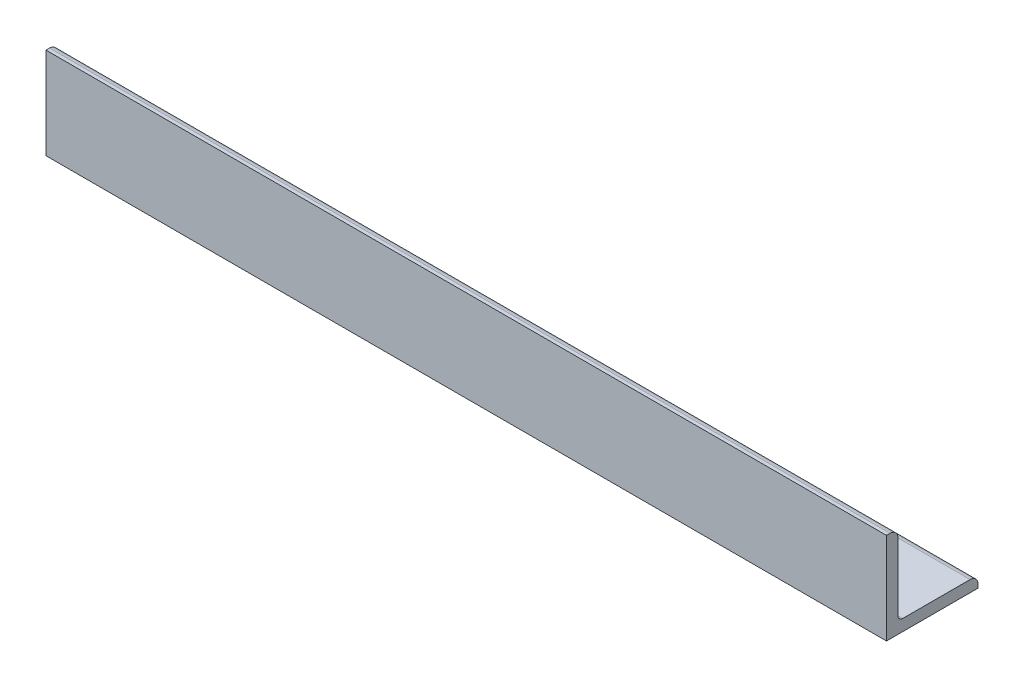
ISO-10303-21;
HEADER;
FILE_DESCRIPTION(('STEP AP214'),'2;1');
FILE_NAME('part.step','',(''),(''),'','','');
FILE_SCHEMA(('AUTOMOTIVE_DESIGN { 1 0 10303 214 1 1 1 1 }'));
ENDSEC;
DATA;
#1=APPLICATION_CONTEXT('core data for automotive mechanical design processes');
#2=APPLICATION_PROTOCOL_DEFINITION('international standard','automotive_design',2000,#1);
#3=PRODUCT_CONTEXT('',#1,'mechanical');
#4=PRODUCT('Part','Part','',(#3));
#5=PRODUCT_RELATED_PRODUCT_CATEGORY('part','',(#4));
#6=PRODUCT_DEFINITION_FORMATION('','',#4);
#7=PRODUCT_DEFINITION_CONTEXT('part definition',#1,'design');
#8=PRODUCT_DEFINITION('design','',#6,#7);
#9=PRODUCT_DEFINITION_SHAPE('','',#8);
#10=(LENGTH_UNIT() NAMED_UNIT(*) SI_UNIT(.MILLI.,.METRE.));
#11=(NAMED_UNIT(*) PLANE_ANGLE_UNIT() SI_UNIT($,.RADIAN.));
#12=(NAMED_UNIT(*) SI_UNIT($,.STERADIAN.) SOLID_ANGLE_UNIT());
#13=UNCERTAINTY_MEASURE_WITH_UNIT(LENGTH_MEASURE(1.E-05),#10,'distance_accuracy_value','');
#14=(GEOMETRIC_REPRESENTATION_CONTEXT(3) GLOBAL_UNCERTAINTY_ASSIGNED_CONTEXT((#13)) GLOBAL_UNIT_ASSIGNED_CONTEXT((#10,
#11,#12)) REPRESENTATION_CONTEXT('',''));
#15=CARTESIAN_POINT('',(0.,0.,0.));
#16=DIRECTION('',(0.,0.,1.));
#17=DIRECTION('',(1.,0.,0.));
#18=AXIS2_PLACEMENT_3D('',#15,#16,#17);
#19=CARTESIAN_POINT('',(175.,0.,-38.1000000000001));
#20=DIRECTION('',(0.,1.,0.));
#21=DIRECTION('',(0.,0.,1.));
#22=AXIS2_PLACEMENT_3D('',#19,#20,#21);
#23=PLANE('',#22);
#24=DIRECTION('',(0.,0.,-1.));
#25=VECTOR('',#24,1.);
#26=CARTESIAN_POINT('',(-175.,0.,-38.1));
#27=LINE('',#26,#25);
#28=CARTESIAN_POINT('',(-175.,0.,0.));
#29=VERTEX_POINT('',#28);
#30=CARTESIAN_POINT('',(-175.,0.,-38.1));
#31=VERTEX_POINT('',#30);
#32=EDGE_CURVE('E215',#29,#31,#27,.T.);
#33=ORIENTED_EDGE('',*,*,#32,.T.);
#34=DIRECTION('',(-1.,0.,0.));
#35=VECTOR('',#34,1.);
#36=CARTESIAN_POINT('',(175.,0.,-38.1000000000001));
#37=LINE('',#36,#35);
#38=CARTESIAN_POINT('',(175.,0.,-38.1000000000001));
#39=VERTEX_POINT('',#38);
#40=EDGE_CURVE('E256',#39,#31,#37,.T.);
#41=ORIENTED_EDGE('',*,*,#40,.F.);
#42=DIRECTION('',(0.,0.,-1.));
#43=VECTOR('',#42,1.);
#44=CARTESIAN_POINT('',(175.,0.,-38.1000000000001));
#45=LINE('',#44,#43);
#46=CARTESIAN_POINT('',(175.,0.,0.));
#47=VERTEX_POINT('',#46);
#48=EDGE_CURVE('E194',#47,#39,#45,.T.);
#49=ORIENTED_EDGE('',*,*,#48,.F.);
#50=DIRECTION('',(-1.,0.,0.));
#51=VECTOR('',#50,1.);
#52=CARTESIAN_POINT('',(175.,0.,0.));
#53=LINE('',#52,#51);
#54=EDGE_CURVE('E214',#47,#29,#53,.T.);
#55=ORIENTED_EDGE('',*,*,#54,.T.);
#56=EDGE_LOOP('',(#33,#41,#49,#55));
#57=FACE_BOUND('',#56,.T.);
#58=CARTESIAN_POINT('',(-87.5,0.,-19.76));
#59=DIRECTION('',(0.,1.,0.));
#60=DIRECTION('',(0.,0.,1.));
#61=AXIS2_PLACEMENT_3D('',#58,#59,#60);
#62=CIRCLE('',#61,4.00000000000001);
#63=CARTESIAN_POINT('',(-87.5,0.,-23.76));
#64=VERTEX_POINT('',#63);
#65=EDGE_CURVE('E190',#64,#64,#62,.T.);
#66=ORIENTED_EDGE('',*,*,#65,.T.);
#67=EDGE_LOOP('',(#66));
#68=FACE_BOUND('',#67,.T.);
#69=CARTESIAN_POINT('',(0.,0.,-12.));
#70=DIRECTION('',(0.,1.,0.));
#71=DIRECTION('',(0.,0.,1.));
#72=AXIS2_PLACEMENT_3D('',#69,#70,#71);
#73=CIRCLE('',#72,5.);
#74=CARTESIAN_POINT('',(-5.,0.,-12.));
#75=VERTEX_POINT('',#74);
#76=CARTESIAN_POINT('',(5.,0.,-12.));
#77=VERTEX_POINT('',#76);
#78=EDGE_CURVE('E82',#75,#77,#73,.T.);
#79=ORIENTED_EDGE('',*,*,#78,.T.);
#80=DIRECTION('',(0.,0.,-1.));
#81=VECTOR('',#80,1.);
#82=CARTESIAN_POINT('',(5.,0.,-12.));
#83=LINE('',#82,#81);
#84=CARTESIAN_POINT('',(5.,0.,-26.1000000000001));
#85=VERTEX_POINT('',#84);
#86=EDGE_CURVE('E170',#77,#85,#83,.T.);
#87=ORIENTED_EDGE('',*,*,#86,.T.);
#88=CARTESIAN_POINT('',(0.,0.,-26.1000000000001));
#89=DIRECTION('',(0.,1.,0.));
#90=DIRECTION('',(0.,0.,1.));
#91=AXIS2_PLACEMENT_3D('',#88,#89,#90);
#92=CIRCLE('',#91,5.);
#93=CARTESIAN_POINT('',(-5.,0.,-26.1000000000001));
#94=VERTEX_POINT('',#93);
#95=EDGE_CURVE('E176',#85,#94,#92,.T.);
#96=ORIENTED_EDGE('',*,*,#95,.T.);
#97=DIRECTION('',(0.,0.,1.));
#98=VECTOR('',#97,1.);
#99=CARTESIAN_POINT('',(-5.,0.,-12.));
#100=LINE('',#99,#98);
#101=EDGE_CURVE('E180',#94,#75,#100,.T.);
#102=ORIENTED_EDGE('',*,*,#101,.T.);
#103=EDGE_LOOP('',(#79,#87,#96,#102));
#104=FACE_BOUND('',#103,.T.);
#105=CARTESIAN_POINT('',(87.5,0.,-19.76));
#106=DIRECTION('',(0.,1.,0.));
#107=DIRECTION('',(0.,0.,-1.));
#108=AXIS2_PLACEMENT_3D('',#105,#106,#107);
#109=CIRCLE('',#108,4.00000000000001);
#110=CARTESIAN_POINT('',(87.5,0.,-23.76));
#111=VERTEX_POINT('',#110);
#112=EDGE_CURVE('E166',#111,#111,#109,.T.);
#113=ORIENTED_EDGE('',*,*,#112,.T.);
#114=EDGE_LOOP('',(#113));
#115=FACE_BOUND('',#114,.T.);
#116=ADVANCED_FACE('F67',(#57,#68,#104,#115),#23,.F.);
#117=CARTESIAN_POINT('',(175.,4.76249999999999,-6.76250000000006));
#118=DIRECTION('',(0.,-1.,0.));
#119=DIRECTION('',(0.,0.,-1.));
#120=AXIS2_PLACEMENT_3D('',#117,#118,#119);
#121=PLANE('',#120);
#122=DIRECTION('',(0.,0.,1.));
#123=VECTOR('',#122,1.);
#124=CARTESIAN_POINT('',(-175.,4.76249999999999,-6.7625));
#125=LINE('',#124,#123);
#126=CARTESIAN_POINT('',(-175.,4.7625,-34.8375));
#127=VERTEX_POINT('',#126);
#128=CARTESIAN_POINT('',(-175.,4.76249999999999,-6.7625));
#129=VERTEX_POINT('',#128);
#130=EDGE_CURVE('E222',#127,#129,#125,.T.);
#131=ORIENTED_EDGE('',*,*,#130,.T.);
#132=DIRECTION('',(-1.,0.,0.));
#133=VECTOR('',#132,1.);
#134=CARTESIAN_POINT('',(175.,4.76249999999999,-6.76250000000006));
#135=LINE('',#134,#133);
#136=CARTESIAN_POINT('',(175.,4.76249999999999,-6.76250000000006));
#137=VERTEX_POINT('',#136);
#138=EDGE_CURVE('E247',#137,#129,#135,.T.);
#139=ORIENTED_EDGE('',*,*,#138,.F.);
#140=DIRECTION('',(0.,0.,1.));
#141=VECTOR('',#140,1.);
#142=CARTESIAN_POINT('',(175.,4.76249999999999,-6.76250000000006));
#143=LINE('',#142,#141);
#144=CARTESIAN_POINT('',(175.,4.7625,-34.8375000000001));
#145=VERTEX_POINT('',#144);
#146=EDGE_CURVE('E202',#145,#137,#143,.T.);
#147=ORIENTED_EDGE('',*,*,#146,.F.);
#148=DIRECTION('',(-1.,0.,0.));
#149=VECTOR('',#148,1.);
#150=CARTESIAN_POINT('',(175.,4.7625,-34.8375000000001));
#151=LINE('',#150,#149);
#152=EDGE_CURVE('E250',#145,#127,#151,.T.);
#153=ORIENTED_EDGE('',*,*,#152,.T.);
#154=EDGE_LOOP('',(#131,#139,#147,#153));
#155=FACE_BOUND('',#154,.T.);
#156=CARTESIAN_POINT('',(-87.5,4.7625,-19.76));
#157=DIRECTION('',(0.,-1.,0.));
#158=DIRECTION('',(0.,0.,-1.));
#159=AXIS2_PLACEMENT_3D('',#156,#157,#158);
#160=CIRCLE('',#159,4.00000000000001);
#161=CARTESIAN_POINT('',(-87.5,4.7625,-23.76));
#162=VERTEX_POINT('',#161);
#163=EDGE_CURVE('E193',#162,#162,#160,.F.);
#164=ORIENTED_EDGE('',*,*,#163,.F.);
#165=EDGE_LOOP('',(#164));
#166=FACE_BOUND('',#165,.T.);
#167=CARTESIAN_POINT('',(0.,4.7625,-12.));
#168=DIRECTION('',(0.,-1.,0.));
#169=DIRECTION('',(0.,0.,-1.));
#170=AXIS2_PLACEMENT_3D('',#167,#168,#169);
#171=CIRCLE('',#170,5.);
#172=CARTESIAN_POINT('',(-5.,4.76250000000001,-12.));
#173=VERTEX_POINT('',#172);
#174=CARTESIAN_POINT('',(5.,4.76250000000001,-12.));
#175=VERTEX_POINT('',#174);
#176=EDGE_CURVE('E13',#173,#175,#171,.F.);
#177=ORIENTED_EDGE('',*,*,#176,.F.);
#178=DIRECTION('',(0.,0.,1.));
#179=VECTOR('',#178,1.);
#180=CARTESIAN_POINT('',(-5.,4.76249999999999,-6.76250000000006));
#181=LINE('',#180,#179);
#182=CARTESIAN_POINT('',(-5.,4.7625,-26.1000000000001));
#183=VERTEX_POINT('',#182);
#184=EDGE_CURVE('E259',#183,#173,#181,.T.);
#185=ORIENTED_EDGE('',*,*,#184,.F.);
#186=CARTESIAN_POINT('',(0.,4.7625,-26.1000000000001));
#187=DIRECTION('',(0.,-1.,0.));
#188=DIRECTION('',(0.,0.,-1.));
#189=AXIS2_PLACEMENT_3D('',#186,#187,#188);
#190=CIRCLE('',#189,5.);
#191=CARTESIAN_POINT('',(5.,4.76250000000001,-26.1000000000001));
#192=VERTEX_POINT('',#191);
#193=EDGE_CURVE('E263',#192,#183,#190,.F.);
#194=ORIENTED_EDGE('',*,*,#193,.F.);
#195=DIRECTION('',(0.,0.,-1.));
#196=VECTOR('',#195,1.);
#197=CARTESIAN_POINT('',(5.,4.76249999999999,-6.76250000000006));
#198=LINE('',#197,#196);
#199=EDGE_CURVE('E75',#175,#192,#198,.T.);
#200=ORIENTED_EDGE('',*,*,#199,.F.);
#201=EDGE_LOOP('',(#177,#185,#194,#200));
#202=FACE_BOUND('',#201,.T.);
#203=CARTESIAN_POINT('',(87.5,4.7625,-19.76));
#204=DIRECTION('',(0.,-1.,0.));
#205=DIRECTION('',(0.,0.,-1.));
#206=AXIS2_PLACEMENT_3D('',#203,#204,#205);
#207=CIRCLE('',#206,4.00000000000001);
#208=CARTESIAN_POINT('',(87.5,4.7625,-23.76));
#209=VERTEX_POINT('',#208);
#210=EDGE_CURVE('E70',#209,#209,#207,.F.);
#211=ORIENTED_EDGE('',*,*,#210,.F.);
#212=EDGE_LOOP('',(#211));
#213=FACE_BOUND('',#212,.T.);
#214=ADVANCED_FACE('F270',(#155,#166,#202,#213),#121,.F.);
#215=CARTESIAN_POINT('',(175.,1.5,-38.1000000000001));
#216=DIRECTION('',(0.,0.,1.));
#217=DIRECTION('',(1.,0.,0.));
#218=AXIS2_PLACEMENT_3D('',#215,#216,#217);
#219=PLANE('',#218);
#220=DIRECTION('',(0.,1.,0.));
#221=VECTOR('',#220,1.);
#222=CARTESIAN_POINT('',(-175.,1.5,-38.1));
#223=LINE('',#222,#221);
#224=CARTESIAN_POINT('',(-175.,1.5,-38.1));
#225=VERTEX_POINT('',#224);
#226=EDGE_CURVE('E218',#31,#225,#223,.T.);
#227=ORIENTED_EDGE('',*,*,#226,.T.);
#228=DIRECTION('',(-1.,0.,0.));
#229=VECTOR('',#228,1.);
#230=CARTESIAN_POINT('',(175.,1.5,-38.1000000000001));
#231=LINE('',#230,#229);
#232=CARTESIAN_POINT('',(175.,1.5,-38.1000000000001));
#233=VERTEX_POINT('',#232);
#234=EDGE_CURVE('E253',#233,#225,#231,.T.);
#235=ORIENTED_EDGE('',*,*,#234,.F.);
#236=DIRECTION('',(0.,1.,0.));
#237=VECTOR('',#236,1.);
#238=CARTESIAN_POINT('',(175.,1.5,-38.1000000000001));
#239=LINE('',#238,#237);
#240=EDGE_CURVE('E197',#39,#233,#239,.T.);
#241=ORIENTED_EDGE('',*,*,#240,.F.);
#242=ORIENTED_EDGE('',*,*,#40,.T.);
#243=EDGE_LOOP('',(#227,#235,#241,#242));
#244=FACE_BOUND('',#243,.T.);
#245=ADVANCED_FACE('F288',(#244),#219,.F.);
#246=CARTESIAN_POINT('',(175.,1.5,-34.8375000000001));
#247=DIRECTION('',(-1.,0.,0.));
#248=DIRECTION('',(0.,0.,1.));
#249=AXIS2_PLACEMENT_3D('',#246,#247,#248);
#250=CYLINDRICAL_SURFACE('',#249,3.2625);
#251=CARTESIAN_POINT('',(-175.,1.5,-34.8375));
#252=DIRECTION('',(1.,0.,0.));
#253=DIRECTION('',(0.,0.,-1.));
#254=AXIS2_PLACEMENT_3D('',#251,#252,#253);
#255=CIRCLE('',#254,3.2625);
#256=EDGE_CURVE('E220',#225,#127,#255,.T.);
#257=ORIENTED_EDGE('',*,*,#256,.T.);
#258=ORIENTED_EDGE('',*,*,#152,.F.);
#259=CARTESIAN_POINT('',(175.,1.5,-34.8375000000001));
#260=DIRECTION('',(1.,0.,0.));
#261=DIRECTION('',(0.,0.,-1.));
#262=AXIS2_PLACEMENT_3D('',#259,#260,#261);
#263=CIRCLE('',#262,3.2625);
#264=EDGE_CURVE('E200',#233,#145,#263,.T.);
#265=ORIENTED_EDGE('',*,*,#264,.F.);
#266=ORIENTED_EDGE('',*,*,#234,.T.);
#267=EDGE_LOOP('',(#257,#258,#265,#266));
#268=FACE_BOUND('',#267,.T.);
#269=ADVANCED_FACE('F334',(#268),#250,.T.);
#270=CARTESIAN_POINT('',(175.,6.76249999999999,-6.76250000000006));
#271=DIRECTION('',(-1.,0.,0.));
#272=DIRECTION('',(0.,0.,1.));
#273=AXIS2_PLACEMENT_3D('',#270,#271,#272);
#274=CYLINDRICAL_SURFACE('',#273,2.);
#275=CARTESIAN_POINT('',(-175.,6.76249999999999,-6.7625));
#276=DIRECTION('',(-1.,0.,0.));
#277=DIRECTION('',(0.,0.,1.));
#278=AXIS2_PLACEMENT_3D('',#275,#276,#277);
#279=CIRCLE('',#278,2.);
#280=CARTESIAN_POINT('',(-175.,6.76249999999999,-4.7625));
#281=VERTEX_POINT('',#280);
#282=EDGE_CURVE('E224',#129,#281,#279,.T.);
#283=ORIENTED_EDGE('',*,*,#282,.T.);
#284=DIRECTION('',(-1.,0.,0.));
#285=VECTOR('',#284,1.);
#286=CARTESIAN_POINT('',(175.,6.76249999999999,-4.76250000000006));
#287=LINE('',#286,#285);
#288=CARTESIAN_POINT('',(175.,6.76249999999999,-4.76250000000006));
#289=VERTEX_POINT('',#288);
#290=EDGE_CURVE('E244',#289,#281,#287,.T.);
#291=ORIENTED_EDGE('',*,*,#290,.F.);
#292=CARTESIAN_POINT('',(175.,6.76249999999999,-6.76250000000006));
#293=DIRECTION('',(-1.,0.,0.));
#294=DIRECTION('',(0.,0.,1.));
#295=AXIS2_PLACEMENT_3D('',#292,#293,#294);
#296=CIRCLE('',#295,2.);
#297=EDGE_CURVE('E204',#137,#289,#296,.T.);
#298=ORIENTED_EDGE('',*,*,#297,.F.);
#299=ORIENTED_EDGE('',*,*,#138,.T.);
#300=EDGE_LOOP('',(#283,#291,#298,#299));
#301=FACE_BOUND('',#300,.T.);
#302=ADVANCED_FACE('F331',(#301),#274,.F.);
#303=CARTESIAN_POINT('',(175.,34.8375,-4.76250000000006));
#304=DIRECTION('',(0.,0.,1.));
#305=DIRECTION('',(1.,0.,0.));
#306=AXIS2_PLACEMENT_3D('',#303,#304,#305);
#307=PLANE('',#306);
#308=DIRECTION('',(0.,1.,0.));
#309=VECTOR('',#308,1.);
#310=CARTESIAN_POINT('',(-175.,34.8375,-4.7625));
#311=LINE('',#310,#309);
#312=CARTESIAN_POINT('',(-175.,34.8375,-4.7625));
#313=VERTEX_POINT('',#312);
#314=EDGE_CURVE('E226',#281,#313,#311,.T.);
#315=ORIENTED_EDGE('',*,*,#314,.T.);
#316=DIRECTION('',(-1.,0.,0.));
#317=VECTOR('',#316,1.);
#318=CARTESIAN_POINT('',(175.,34.8375,-4.76250000000006));
#319=LINE('',#318,#317);
#320=CARTESIAN_POINT('',(175.,34.8375,-4.76250000000006));
#321=VERTEX_POINT('',#320);
#322=EDGE_CURVE('E241',#321,#313,#319,.T.);
#323=ORIENTED_EDGE('',*,*,#322,.F.);
#324=DIRECTION('',(0.,1.,0.));
#325=VECTOR('',#324,1.);
#326=CARTESIAN_POINT('',(175.,34.8375,-4.76250000000006));
#327=LINE('',#326,#325);
#328=EDGE_CURVE('E206',#289,#321,#327,.T.);
#329=ORIENTED_EDGE('',*,*,#328,.F.);
#330=ORIENTED_EDGE('',*,*,#290,.T.);
#331=EDGE_LOOP('',(#315,#323,#329,#330));
#332=FACE_BOUND('',#331,.T.);
#333=ADVANCED_FACE('F327',(#332),#307,.F.);
#334=CARTESIAN_POINT('',(175.,34.8375,-1.50000000000006));
#335=DIRECTION('',(-1.,0.,0.));
#336=DIRECTION('',(0.,0.,1.));
#337=AXIS2_PLACEMENT_3D('',#334,#335,#336);
#338=CYLINDRICAL_SURFACE('',#337,3.2625);
#339=CARTESIAN_POINT('',(-175.,34.8375,-1.5));
#340=DIRECTION('',(1.,0.,0.));
#341=DIRECTION('',(0.,0.,1.));
#342=AXIS2_PLACEMENT_3D('',#339,#340,#341);
#343=CIRCLE('',#342,3.2625);
#344=CARTESIAN_POINT('',(-175.,38.1,-1.5));
#345=VERTEX_POINT('',#344);
#346=EDGE_CURVE('E228',#313,#345,#343,.T.);
#347=ORIENTED_EDGE('',*,*,#346,.T.);
#348=DIRECTION('',(-1.,0.,0.));
#349=VECTOR('',#348,1.);
#350=CARTESIAN_POINT('',(175.,38.1,-1.50000000000006));
#351=LINE('',#350,#349);
#352=CARTESIAN_POINT('',(175.,38.1,-1.50000000000006));
#353=VERTEX_POINT('',#352);
#354=EDGE_CURVE('E238',#353,#345,#351,.T.);
#355=ORIENTED_EDGE('',*,*,#354,.F.);
#356=CARTESIAN_POINT('',(175.,34.8375,-1.50000000000006));
#357=DIRECTION('',(1.,0.,0.));
#358=DIRECTION('',(0.,0.,1.));
#359=AXIS2_PLACEMENT_3D('',#356,#357,#358);
#360=CIRCLE('',#359,3.2625);
#361=EDGE_CURVE('E208',#321,#353,#360,.T.);
#362=ORIENTED_EDGE('',*,*,#361,.F.);
#363=ORIENTED_EDGE('',*,*,#322,.T.);
#364=EDGE_LOOP('',(#347,#355,#362,#363));
#365=FACE_BOUND('',#364,.T.);
#366=ADVANCED_FACE('F323',(#365),#338,.T.);
#367=CARTESIAN_POINT('',(175.,38.1,0.));
#368=DIRECTION('',(0.,-1.,0.));
#369=DIRECTION('',(0.,0.,-1.));
#370=AXIS2_PLACEMENT_3D('',#367,#368,#369);
#371=PLANE('',#370);
#372=DIRECTION('',(0.,0.,1.));
#373=VECTOR('',#372,1.);
#374=CARTESIAN_POINT('',(-175.,38.1,0.));
#375=LINE('',#374,#373);
#376=CARTESIAN_POINT('',(-175.,38.1,0.));
#377=VERTEX_POINT('',#376);
#378=EDGE_CURVE('E230',#345,#377,#375,.T.);
#379=ORIENTED_EDGE('',*,*,#378,.T.);
#380=DIRECTION('',(-1.,0.,0.));
#381=VECTOR('',#380,1.);
#382=CARTESIAN_POINT('',(175.,38.1,0.));
#383=LINE('',#382,#381);
#384=CARTESIAN_POINT('',(175.,38.1,0.));
#385=VERTEX_POINT('',#384);
#386=EDGE_CURVE('E235',#385,#377,#383,.T.);
#387=ORIENTED_EDGE('',*,*,#386,.F.);
#388=DIRECTION('',(0.,0.,1.));
#389=VECTOR('',#388,1.);
#390=CARTESIAN_POINT('',(175.,38.1,0.));
#391=LINE('',#390,#389);
#392=EDGE_CURVE('E210',#353,#385,#391,.T.);
#393=ORIENTED_EDGE('',*,*,#392,.F.);
#394=ORIENTED_EDGE('',*,*,#354,.T.);
#395=EDGE_LOOP('',(#379,#387,#393,#394));
#396=FACE_BOUND('',#395,.T.);
#397=ADVANCED_FACE('F319',(#396),#371,.F.);
#398=CARTESIAN_POINT('',(175.,0.,0.));
#399=DIRECTION('',(0.,0.,-1.));
#400=DIRECTION('',(-1.,0.,0.));
#401=AXIS2_PLACEMENT_3D('',#398,#399,#400);
#402=PLANE('',#401);
#403=DIRECTION('',(0.,-1.,0.));
#404=VECTOR('',#403,1.);
#405=CARTESIAN_POINT('',(-175.,0.,0.));
#406=LINE('',#405,#404);
#407=EDGE_CURVE('E198',#377,#29,#406,.T.);
#408=ORIENTED_EDGE('',*,*,#407,.T.);
#409=ORIENTED_EDGE('',*,*,#54,.F.);
#410=DIRECTION('',(0.,-1.,0.));
#411=VECTOR('',#410,1.);
#412=CARTESIAN_POINT('',(175.,0.,0.));
#413=LINE('',#412,#411);
#414=EDGE_CURVE('E212',#385,#47,#413,.T.);
#415=ORIENTED_EDGE('',*,*,#414,.F.);
#416=ORIENTED_EDGE('',*,*,#386,.T.);
#417=EDGE_LOOP('',(#408,#409,#415,#416));
#418=FACE_BOUND('',#417,.T.);
#419=ADVANCED_FACE('F314',(#418),#402,.F.);
#420=CARTESIAN_POINT('',(175.,34.8375,-1.50000000000006));
#421=DIRECTION('',(-1.,0.,0.));
#422=DIRECTION('',(0.,0.,1.));
#423=AXIS2_PLACEMENT_3D('',#420,#421,#422);
#424=PLANE('',#423);
#425=ORIENTED_EDGE('',*,*,#48,.T.);
#426=ORIENTED_EDGE('',*,*,#240,.T.);
#427=ORIENTED_EDGE('',*,*,#264,.T.);
#428=ORIENTED_EDGE('',*,*,#146,.T.);
#429=ORIENTED_EDGE('',*,*,#297,.T.);
#430=ORIENTED_EDGE('',*,*,#328,.T.);
#431=ORIENTED_EDGE('',*,*,#361,.T.);
#432=ORIENTED_EDGE('',*,*,#392,.T.);
#433=ORIENTED_EDGE('',*,*,#414,.T.);
#434=EDGE_LOOP('',(#425,#426,#427,#428,#429,#430,#431,#432,#433));
#435=FACE_BOUND('',#434,.T.);
#436=ADVANCED_FACE('F308',(#435),#424,.F.);
#437=CARTESIAN_POINT('',(-175.,34.8375,-1.5));
#438=DIRECTION('',(-1.,0.,0.));
#439=DIRECTION('',(0.,0.,1.));
#440=AXIS2_PLACEMENT_3D('',#437,#438,#439);
#441=PLANE('',#440);
#442=ORIENTED_EDGE('',*,*,#32,.F.);
#443=ORIENTED_EDGE('',*,*,#407,.F.);
#444=ORIENTED_EDGE('',*,*,#378,.F.);
#445=ORIENTED_EDGE('',*,*,#346,.F.);
#446=ORIENTED_EDGE('',*,*,#314,.F.);
#447=ORIENTED_EDGE('',*,*,#282,.F.);
#448=ORIENTED_EDGE('',*,*,#130,.F.);
#449=ORIENTED_EDGE('',*,*,#256,.F.);
#450=ORIENTED_EDGE('',*,*,#226,.F.);
#451=EDGE_LOOP('',(#442,#443,#444,#445,#446,#447,#448,#449,#450));
#452=FACE_BOUND('',#451,.T.);
#453=ADVANCED_FACE('F299',(#452),#441,.T.);
#454=CARTESIAN_POINT('',(-87.5,38.1,-19.76));
#455=DIRECTION('',(0.,-1.,0.));
#456=DIRECTION('',(0.,0.,-1.));
#457=AXIS2_PLACEMENT_3D('',#454,#455,#456);
#458=CYLINDRICAL_SURFACE('',#457,4.00000000000001);
#459=CARTESIAN_POINT('',(-87.5,0.,-23.76));
#460=CARTESIAN_POINT('',(-87.5,0.049609375,-23.76));
#461=CARTESIAN_POINT('',(-87.5,0.09921875,-23.76));
#462=CARTESIAN_POINT('',(-87.5,0.1984375,-23.76));
#463=CARTESIAN_POINT('',(-87.5,0.248046875,-23.76));
#464=CARTESIAN_POINT('',(-87.5,0.347265625,-23.76));
#465=CARTESIAN_POINT('',(-87.5,0.396875,-23.76));
#466=CARTESIAN_POINT('',(-87.5,0.49609375,-23.76));
#467=CARTESIAN_POINT('',(-87.5,0.545703125,-23.76));
#468=CARTESIAN_POINT('',(-87.5,0.644921875,-23.76));
#469=CARTESIAN_POINT('',(-87.5,0.69453125,-23.76));
#470=CARTESIAN_POINT('',(-87.5,0.793750000000001,-23.76));
#471=CARTESIAN_POINT('',(-87.5,0.843359375,-23.76));
#472=CARTESIAN_POINT('',(-87.5,0.942578125000001,-23.76));
#473=CARTESIAN_POINT('',(-87.5,0.992187500000001,-23.76));
#474=CARTESIAN_POINT('',(-87.5,1.09140625,-23.76));
#475=CARTESIAN_POINT('',(-87.5,1.141015625,-23.76));
#476=CARTESIAN_POINT('',(-87.5,1.240234375,-23.76));
#477=CARTESIAN_POINT('',(-87.5,1.28984375,-23.76));
#478=CARTESIAN_POINT('',(-87.5,1.3890625,-23.76));
#479=CARTESIAN_POINT('',(-87.5,1.438671875,-23.76));
#480=CARTESIAN_POINT('',(-87.5,1.537890625,-23.76));
#481=CARTESIAN_POINT('',(-87.5,1.5875,-23.76));
#482=CARTESIAN_POINT('',(-87.5,1.68671875,-23.76));
#483=CARTESIAN_POINT('',(-87.5,1.736328125,-23.76));
#484=CARTESIAN_POINT('',(-87.5,1.835546875,-23.76));
#485=CARTESIAN_POINT('',(-87.5,1.88515625,-23.76));
#486=CARTESIAN_POINT('',(-87.5,1.984375,-23.76));
#487=CARTESIAN_POINT('',(-87.5,2.033984375,-23.76));
#488=CARTESIAN_POINT('',(-87.5,2.133203125,-23.76));
#489=CARTESIAN_POINT('',(-87.5,2.1828125,-23.76));
#490=CARTESIAN_POINT('',(-87.5,2.28203125,-23.76));
#491=CARTESIAN_POINT('',(-87.5,2.331640625,-23.76));
#492=CARTESIAN_POINT('',(-87.5,2.430859375,-23.76));
#493=CARTESIAN_POINT('',(-87.5,2.48046875,-23.76));
#494=CARTESIAN_POINT('',(-87.5,2.5796875,-23.76));
#495=CARTESIAN_POINT('',(-87.5,2.629296875,-23.76));
#496=CARTESIAN_POINT('',(-87.5,2.728515625,-23.76));
#497=CARTESIAN_POINT('',(-87.5,2.778125,-23.76));
#498=CARTESIAN_POINT('',(-87.5,2.87734375,-23.76));
#499=CARTESIAN_POINT('',(-87.5,2.926953125,-23.76));
#500=CARTESIAN_POINT('',(-87.5,3.026171875,-23.76));
#501=CARTESIAN_POINT('',(-87.5,3.07578125,-23.76));
#502=CARTESIAN_POINT('',(-87.5,3.175,-23.76));
#503=CARTESIAN_POINT('',(-87.5,3.224609375,-23.76));
#504=CARTESIAN_POINT('',(-87.5,3.323828125,-23.76));
#505=CARTESIAN_POINT('',(-87.5,3.3734375,-23.76));
#506=CARTESIAN_POINT('',(-87.5,3.47265625,-23.76));
#507=CARTESIAN_POINT('',(-87.5,3.522265625,-23.76));
#508=CARTESIAN_POINT('',(-87.5,3.621484375,-23.76));
#509=CARTESIAN_POINT('',(-87.5,3.67109375,-23.76));
#510=CARTESIAN_POINT('',(-87.5,3.7703125,-23.76));
#511=CARTESIAN_POINT('',(-87.5,3.819921875,-23.76));
#512=CARTESIAN_POINT('',(-87.5,3.919140625,-23.76));
#513=CARTESIAN_POINT('',(-87.5,3.96875,-23.76));
#514=CARTESIAN_POINT('',(-87.5,4.06796875,-23.76));
#515=CARTESIAN_POINT('',(-87.5,4.117578125,-23.76));
#516=CARTESIAN_POINT('',(-87.5,4.216796875,-23.76));
#517=CARTESIAN_POINT('',(-87.5,4.26640625,-23.76));
#518=CARTESIAN_POINT('',(-87.5,4.365625,-23.76));
#519=CARTESIAN_POINT('',(-87.5,4.415234375,-23.76));
#520=CARTESIAN_POINT('',(-87.5,4.514453125,-23.76));
#521=CARTESIAN_POINT('',(-87.5,4.5640625,-23.76));
#522=CARTESIAN_POINT('',(-87.5,4.66328125,-23.76));
#523=CARTESIAN_POINT('',(-87.5,4.712890625,-23.76));
#524=CARTESIAN_POINT('',(-87.5,4.7625,-23.76));
#525=B_SPLINE_CURVE_WITH_KNOTS('',3,(#459,#460,#461,#462,#463,#464,#465,#466,#467,#468,#469,
#470,#471,#472,#473,#474,#475,#476,#477,#478,#479,#480,#481,#482,#483,#484,#485,#486,#487,#488,
#489,#490,#491,#492,#493,#494,#495,#496,#497,#498,#499,#500,#501,#502,#503,#504,#505,#506,#507,
#508,#509,#510,#511,#512,#513,#514,#515,#516,#517,#518,#519,#520,#521,#522,#523,#524),
.UNSPECIFIED.,.F.,.F.,(4,2,2,2,2,2,2,2,2,2,2,2,2,2,2,2,2,2,2,2,2,2,2,2,2,2,2,2,2,2,2,2,4),(0.,
0.148828125,0.29765625,0.446484375,0.5953125,0.744140625,0.892968750000001,1.041796875,1.190625,
1.339453125,1.48828125,1.637109375,1.7859375,1.934765625,2.08359375,2.232421875,2.38125,
2.530078125,2.67890625,2.827734375,2.9765625,3.125390625,3.27421875,3.423046875,3.571875,
3.720703125,3.86953125,4.018359375,4.1671875,4.316015625,4.46484375,4.613671875,4.7625),.UNSPECIFIED.);
#526=EDGE_CURVE('BSEAM296',#64,#162,#525,.T.);
#527=ORIENTED_EDGE('',*,*,#65,.F.);
#528=ORIENTED_EDGE('',*,*,#163,.T.);
#529=ORIENTED_EDGE('',*,*,#526,.T.);
#530=ORIENTED_EDGE('',*,*,#526,.F.);
#531=EDGE_LOOP('',(#527,#529,#528,#530));
#532=FACE_BOUND('',#531,.T.);
#533=ADVANCED_FACE('F296',(#532),#458,.F.);
#534=CARTESIAN_POINT('',(0.,38.1,-12.));
#535=DIRECTION('',(0.,-1.,0.));
#536=DIRECTION('',(0.,0.,-1.));
#537=AXIS2_PLACEMENT_3D('',#534,#535,#536);
#538=CYLINDRICAL_SURFACE('',#537,5.);
#539=ORIENTED_EDGE('',*,*,#176,.T.);
#540=DIRECTION('',(0.,-1.,0.));
#541=VECTOR('',#540,1.);
#542=CARTESIAN_POINT('',(5.,38.1,-12.));
#543=LINE('',#542,#541);
#544=EDGE_CURVE('E160',#175,#77,#543,.T.);
#545=ORIENTED_EDGE('',*,*,#544,.T.);
#546=ORIENTED_EDGE('',*,*,#78,.F.);
#547=DIRECTION('',(0.,-1.,0.));
#548=VECTOR('',#547,1.);
#549=CARTESIAN_POINT('',(-5.,38.1,-12.));
#550=LINE('',#549,#548);
#551=EDGE_CURVE('E186',#173,#75,#550,.T.);
#552=ORIENTED_EDGE('',*,*,#551,.F.);
#553=EDGE_LOOP('',(#539,#545,#546,#552));
#554=FACE_BOUND('',#553,.T.);
#555=ADVANCED_FACE('F162',(#554),#538,.F.);
#556=CARTESIAN_POINT('',(5.,38.1,-12.));
#557=DIRECTION('',(-1.,0.,0.));
#558=DIRECTION('',(0.,0.,1.));
#559=AXIS2_PLACEMENT_3D('',#556,#557,#558);
#560=PLANE('',#559);
#561=ORIENTED_EDGE('',*,*,#199,.T.);
#562=DIRECTION('',(0.,-1.,0.));
#563=VECTOR('',#562,1.);
#564=CARTESIAN_POINT('',(5.,38.1,-26.1000000000001));
#565=LINE('',#564,#563);
#566=EDGE_CURVE('E167',#192,#85,#565,.T.);
#567=ORIENTED_EDGE('',*,*,#566,.T.);
#568=ORIENTED_EDGE('',*,*,#86,.F.);
#569=ORIENTED_EDGE('',*,*,#544,.F.);
#570=EDGE_LOOP('',(#561,#567,#568,#569));
#571=FACE_BOUND('',#570,.T.);
#572=ADVANCED_FACE('F171',(#571),#560,.T.);
#573=CARTESIAN_POINT('',(0.,38.1,-26.1000000000001));
#574=DIRECTION('',(0.,-1.,0.));
#575=DIRECTION('',(0.,0.,-1.));
#576=AXIS2_PLACEMENT_3D('',#573,#574,#575);
#577=CYLINDRICAL_SURFACE('',#576,5.);
#578=ORIENTED_EDGE('',*,*,#193,.T.);
#579=DIRECTION('',(0.,-1.,0.));
#580=VECTOR('',#579,1.);
#581=CARTESIAN_POINT('',(-5.,38.1,-26.1000000000001));
#582=LINE('',#581,#580);
#583=EDGE_CURVE('E90',#183,#94,#582,.T.);
#584=ORIENTED_EDGE('',*,*,#583,.T.);
#585=ORIENTED_EDGE('',*,*,#95,.F.);
#586=ORIENTED_EDGE('',*,*,#566,.F.);
#587=EDGE_LOOP('',(#578,#584,#585,#586));
#588=FACE_BOUND('',#587,.T.);
#589=ADVANCED_FACE('F268',(#588),#577,.F.);
#590=CARTESIAN_POINT('',(-5.,38.1,-12.));
#591=DIRECTION('',(1.,0.,0.));
#592=DIRECTION('',(0.,0.,-1.));
#593=AXIS2_PLACEMENT_3D('',#590,#591,#592);
#594=PLANE('',#593);
#595=ORIENTED_EDGE('',*,*,#184,.T.);
#596=ORIENTED_EDGE('',*,*,#551,.T.);
#597=ORIENTED_EDGE('',*,*,#101,.F.);
#598=ORIENTED_EDGE('',*,*,#583,.F.);
#599=EDGE_LOOP('',(#595,#596,#597,#598));
#600=FACE_BOUND('',#599,.T.);
#601=ADVANCED_FACE('F272',(#600),#594,.T.);
#602=CARTESIAN_POINT('',(87.5,38.1,-19.76));
#603=DIRECTION('',(0.,-1.,0.));
#604=DIRECTION('',(0.,0.,-1.));
#605=AXIS2_PLACEMENT_3D('',#602,#603,#604);
#606=CYLINDRICAL_SURFACE('',#605,4.00000000000001);
#607=CARTESIAN_POINT('',(87.5,0.,-23.76));
#608=CARTESIAN_POINT('',(87.5,0.049609375,-23.76));
#609=CARTESIAN_POINT('',(87.5,0.09921875,-23.76));
#610=CARTESIAN_POINT('',(87.5,0.1984375,-23.76));
#611=CARTESIAN_POINT('',(87.5,0.248046875,-23.76));
#612=CARTESIAN_POINT('',(87.5,0.347265625,-23.76));
#613=CARTESIAN_POINT('',(87.5,0.396875,-23.76));
#614=CARTESIAN_POINT('',(87.5,0.49609375,-23.76));
#615=CARTESIAN_POINT('',(87.5,0.545703125,-23.76));
#616=CARTESIAN_POINT('',(87.5,0.644921875,-23.76));
#617=CARTESIAN_POINT('',(87.5,0.69453125,-23.76));
#618=CARTESIAN_POINT('',(87.5,0.793750000000001,-23.76));
#619=CARTESIAN_POINT('',(87.5,0.843359375,-23.76));
#620=CARTESIAN_POINT('',(87.5,0.942578125000001,-23.76));
#621=CARTESIAN_POINT('',(87.5,0.992187500000001,-23.76));
#622=CARTESIAN_POINT('',(87.5,1.09140625,-23.76));
#623=CARTESIAN_POINT('',(87.5,1.141015625,-23.76));
#624=CARTESIAN_POINT('',(87.5,1.240234375,-23.76));
#625=CARTESIAN_POINT('',(87.5,1.28984375,-23.76));
#626=CARTESIAN_POINT('',(87.5,1.3890625,-23.76));
#627=CARTESIAN_POINT('',(87.5,1.438671875,-23.76));
#628=CARTESIAN_POINT('',(87.5,1.537890625,-23.76));
#629=CARTESIAN_POINT('',(87.5,1.5875,-23.76));
#630=CARTESIAN_POINT('',(87.5,1.68671875,-23.76));
#631=CARTESIAN_POINT('',(87.5,1.736328125,-23.76));
#632=CARTESIAN_POINT('',(87.5,1.835546875,-23.76));
#633=CARTESIAN_POINT('',(87.5,1.88515625,-23.76));
#634=CARTESIAN_POINT('',(87.5,1.984375,-23.76));
#635=CARTESIAN_POINT('',(87.5,2.033984375,-23.76));
#636=CARTESIAN_POINT('',(87.5,2.133203125,-23.76));
#637=CARTESIAN_POINT('',(87.5,2.1828125,-23.76));
#638=CARTESIAN_POINT('',(87.5,2.28203125,-23.76));
#639=CARTESIAN_POINT('',(87.5,2.331640625,-23.76));
#640=CARTESIAN_POINT('',(87.5,2.430859375,-23.76));
#641=CARTESIAN_POINT('',(87.5,2.48046875,-23.76));
#642=CARTESIAN_POINT('',(87.5,2.5796875,-23.76));
#643=CARTESIAN_POINT('',(87.5,2.629296875,-23.76));
#644=CARTESIAN_POINT('',(87.5,2.728515625,-23.76));
#645=CARTESIAN_POINT('',(87.5,2.778125,-23.76));
#646=CARTESIAN_POINT('',(87.5,2.87734375,-23.76));
#647=CARTESIAN_POINT('',(87.5,2.926953125,-23.76));
#648=CARTESIAN_POINT('',(87.5,3.026171875,-23.76));
#649=CARTESIAN_POINT('',(87.5,3.07578125,-23.76));
#650=CARTESIAN_POINT('',(87.5,3.175,-23.76));
#651=CARTESIAN_POINT('',(87.5,3.224609375,-23.76));
#652=CARTESIAN_POINT('',(87.5,3.323828125,-23.76));
#653=CARTESIAN_POINT('',(87.5,3.3734375,-23.76));
#654=CARTESIAN_POINT('',(87.5,3.47265625,-23.76));
#655=CARTESIAN_POINT('',(87.5,3.522265625,-23.76));
#656=CARTESIAN_POINT('',(87.5,3.621484375,-23.76));
#657=CARTESIAN_POINT('',(87.5,3.67109375,-23.76));
#658=CARTESIAN_POINT('',(87.5,3.7703125,-23.76));
#659=CARTESIAN_POINT('',(87.5,3.819921875,-23.76));
#660=CARTESIAN_POINT('',(87.5,3.919140625,-23.76));
#661=CARTESIAN_POINT('',(87.5,3.96875,-23.76));
#662=CARTESIAN_POINT('',(87.5,4.06796875,-23.76));
#663=CARTESIAN_POINT('',(87.5,4.117578125,-23.76));
#664=CARTESIAN_POINT('',(87.5,4.216796875,-23.76));
#665=CARTESIAN_POINT('',(87.5,4.26640625,-23.76));
#666=CARTESIAN_POINT('',(87.5,4.365625,-23.76));
#667=CARTESIAN_POINT('',(87.5,4.415234375,-23.76));
#668=CARTESIAN_POINT('',(87.5,4.514453125,-23.76));
#669=CARTESIAN_POINT('',(87.5,4.5640625,-23.76));
#670=CARTESIAN_POINT('',(87.5,4.66328125,-23.76));
#671=CARTESIAN_POINT('',(87.5,4.712890625,-23.76));
#672=CARTESIAN_POINT('',(87.5,4.7625,-23.76));
#673=B_SPLINE_CURVE_WITH_KNOTS('',3,(#607,#608,#609,#610,#611,#612,#613,#614,#615,#616,#617,
#618,#619,#620,#621,#622,#623,#624,#625,#626,#627,#628,#629,#630,#631,#632,#633,#634,#635,#636,
#637,#638,#639,#640,#641,#642,#643,#644,#645,#646,#647,#648,#649,#650,#651,#652,#653,#654,#655,
#656,#657,#658,#659,#660,#661,#662,#663,#664,#665,#666,#667,#668,#669,#670,#671,#672),
.UNSPECIFIED.,.F.,.F.,(4,2,2,2,2,2,2,2,2,2,2,2,2,2,2,2,2,2,2,2,2,2,2,2,2,2,2,2,2,2,2,2,4),(0.,
0.148828125,0.29765625,0.446484375,0.5953125,0.744140625,0.892968750000001,1.041796875,1.190625,
1.339453125,1.48828125,1.637109375,1.7859375,1.934765625,2.08359375,2.232421875,2.38125,
2.530078125,2.67890625,2.827734375,2.9765625,3.125390625,3.27421875,3.423046875,3.571875,
3.720703125,3.86953125,4.018359375,4.1671875,4.316015625,4.46484375,4.613671875,4.7625),.UNSPECIFIED.);
#674=EDGE_CURVE('BSEAM274',#111,#209,#673,.T.);
#675=ORIENTED_EDGE('',*,*,#112,.F.);
#676=ORIENTED_EDGE('',*,*,#210,.T.);
#677=ORIENTED_EDGE('',*,*,#674,.T.);
#678=ORIENTED_EDGE('',*,*,#674,.F.);
#679=EDGE_LOOP('',(#675,#677,#676,#678));
#680=FACE_BOUND('',#679,.T.);
#681=ADVANCED_FACE('F274',(#680),#606,.F.);
#682=CLOSED_SHELL('',(#116,#214,#245,#269,#302,#333,#366,#397,#419,#436,#453,#533,#555,#572,
#589,#601,#681));
#683=MANIFOLD_SOLID_BREP('B2',#682);
#684=ADVANCED_BREP_SHAPE_REPRESENTATION('',(#18,#683),#14);
#685=SHAPE_DEFINITION_REPRESENTATION(#9,#684);
ENDSEC;
END-ISO-10303-21;
